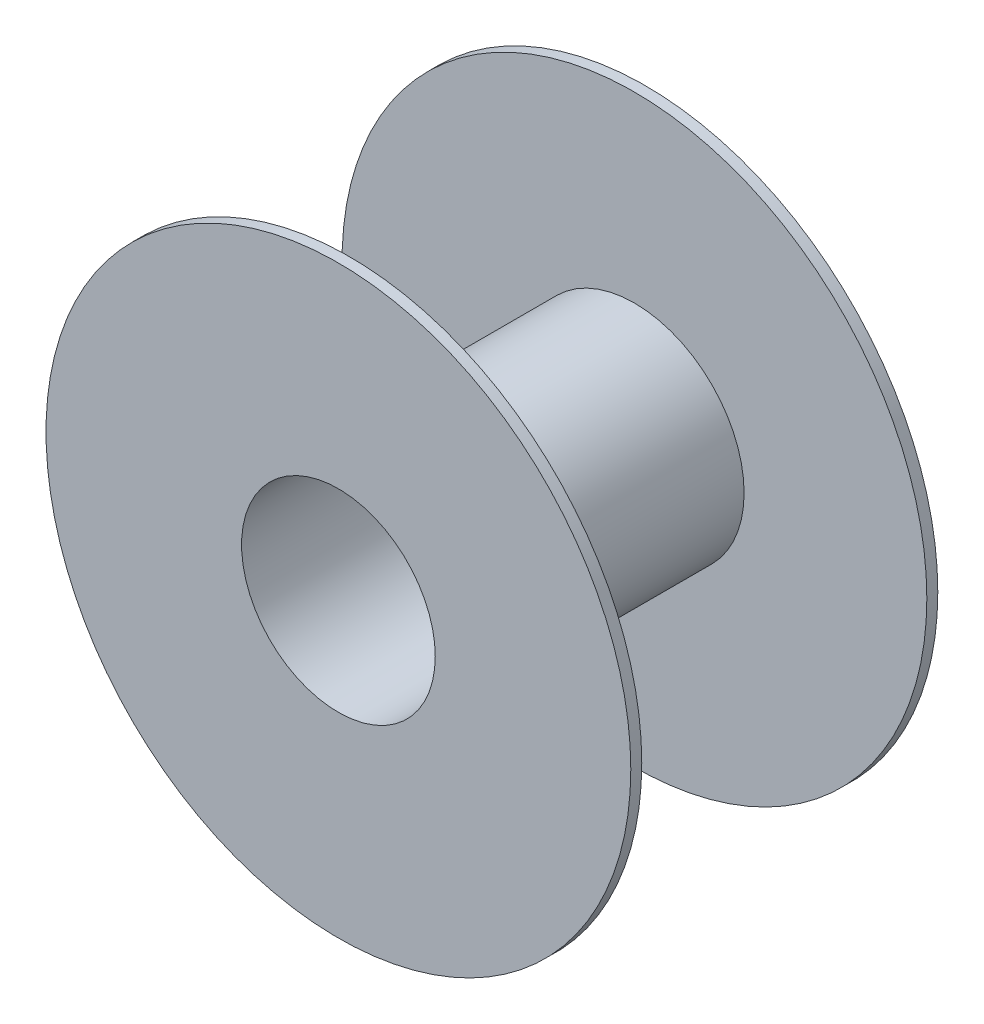
ISO-10303-21;
HEADER;
FILE_DESCRIPTION(('STEP AP214'),'2;1');
FILE_NAME('part.step','',(''),(''),'','','');
FILE_SCHEMA(('AUTOMOTIVE_DESIGN { 1 0 10303 214 1 1 1 1 }'));
ENDSEC;
DATA;
#1=APPLICATION_CONTEXT('core data for automotive mechanical design processes');
#2=APPLICATION_PROTOCOL_DEFINITION('international standard','automotive_design',2000,#1);
#3=PRODUCT_CONTEXT('',#1,'mechanical');
#4=PRODUCT('Part','Part','',(#3));
#5=PRODUCT_RELATED_PRODUCT_CATEGORY('part','',(#4));
#6=PRODUCT_DEFINITION_FORMATION('','',#4);
#7=PRODUCT_DEFINITION_CONTEXT('part definition',#1,'design');
#8=PRODUCT_DEFINITION('design','',#6,#7);
#9=PRODUCT_DEFINITION_SHAPE('','',#8);
#10=(LENGTH_UNIT() NAMED_UNIT(*) SI_UNIT(.MILLI.,.METRE.));
#11=(NAMED_UNIT(*) PLANE_ANGLE_UNIT() SI_UNIT($,.RADIAN.));
#12=(NAMED_UNIT(*) SI_UNIT($,.STERADIAN.) SOLID_ANGLE_UNIT());
#13=UNCERTAINTY_MEASURE_WITH_UNIT(LENGTH_MEASURE(1.E-05),#10,'distance_accuracy_value','');
#14=(GEOMETRIC_REPRESENTATION_CONTEXT(3) GLOBAL_UNCERTAINTY_ASSIGNED_CONTEXT((#13)) GLOBAL_UNIT_ASSIGNED_CONTEXT((#10,
#11,#12)) REPRESENTATION_CONTEXT('',''));
#15=CARTESIAN_POINT('',(0.,0.,0.));
#16=DIRECTION('',(0.,0.,1.));
#17=DIRECTION('',(1.,0.,0.));
#18=AXIS2_PLACEMENT_3D('',#15,#16,#17);
#19=CARTESIAN_POINT('',(80.,0.,0.));
#20=DIRECTION('',(0.,0.,1.));
#21=DIRECTION('',(1.,0.,0.));
#22=AXIS2_PLACEMENT_3D('',#19,#20,#21);
#23=PLANE('',#22);
#24=CARTESIAN_POINT('',(0.,0.,0.));
#25=DIRECTION('',(0.,0.,1.));
#26=DIRECTION('',(1.,0.,0.));
#27=AXIS2_PLACEMENT_3D('',#24,#25,#26);
#28=CIRCLE('',#27,80.);
#29=CARTESIAN_POINT('',(80.,0.,0.));
#30=VERTEX_POINT('',#29);
#31=EDGE_CURVE('E58',#30,#30,#28,.T.);
#32=ORIENTED_EDGE('',*,*,#31,.T.);
#33=EDGE_LOOP('',(#32));
#34=FACE_BOUND('',#33,.T.);
#35=CARTESIAN_POINT('',(0.,0.,0.));
#36=DIRECTION('',(0.,0.,1.));
#37=DIRECTION('',(1.,0.,0.));
#38=AXIS2_PLACEMENT_3D('',#35,#36,#37);
#39=CIRCLE('',#38,26.5);
#40=CARTESIAN_POINT('',(26.5,0.,0.));
#41=VERTEX_POINT('',#40);
#42=EDGE_CURVE('E10',#41,#41,#39,.T.);
#43=ORIENTED_EDGE('',*,*,#42,.F.);
#44=EDGE_LOOP('',(#43));
#45=FACE_BOUND('',#44,.T.);
#46=ADVANCED_FACE('F30',(#34,#45),#23,.T.);
#47=CARTESIAN_POINT('',(0.,0.,0.));
#48=DIRECTION('',(0.,0.,1.));
#49=DIRECTION('',(1.,0.,0.));
#50=AXIS2_PLACEMENT_3D('',#47,#48,#49);
#51=CYLINDRICAL_SURFACE('',#50,26.5);
#52=ORIENTED_EDGE('',*,*,#42,.T.);
#53=EDGE_LOOP('',(#52));
#54=FACE_BOUND('',#53,.T.);
#55=CARTESIAN_POINT('',(0.,0.,-84.));
#56=DIRECTION('',(0.,0.,1.));
#57=DIRECTION('',(1.,0.,0.));
#58=AXIS2_PLACEMENT_3D('',#55,#56,#57);
#59=CIRCLE('',#58,26.5);
#60=CARTESIAN_POINT('',(26.5,0.,-84.));
#61=VERTEX_POINT('',#60);
#62=EDGE_CURVE('E36',#61,#61,#59,.T.);
#63=ORIENTED_EDGE('',*,*,#62,.F.);
#64=EDGE_LOOP('',(#63));
#65=FACE_BOUND('',#64,.T.);
#66=ADVANCED_FACE('F76',(#54,#65),#51,.F.);
#67=CARTESIAN_POINT('',(26.5,0.,-84.));
#68=DIRECTION('',(0.,0.,-1.));
#69=DIRECTION('',(-1.,0.,0.));
#70=AXIS2_PLACEMENT_3D('',#67,#68,#69);
#71=PLANE('',#70);
#72=ORIENTED_EDGE('',*,*,#62,.T.);
#73=EDGE_LOOP('',(#72));
#74=FACE_BOUND('',#73,.T.);
#75=CARTESIAN_POINT('',(0.,0.,-84.));
#76=DIRECTION('',(0.,0.,1.));
#77=DIRECTION('',(1.,0.,0.));
#78=AXIS2_PLACEMENT_3D('',#75,#76,#77);
#79=CIRCLE('',#78,80.);
#80=CARTESIAN_POINT('',(80.,0.,-84.));
#81=VERTEX_POINT('',#80);
#82=EDGE_CURVE('E40',#81,#81,#79,.T.);
#83=ORIENTED_EDGE('',*,*,#82,.F.);
#84=EDGE_LOOP('',(#83));
#85=FACE_BOUND('',#84,.T.);
#86=ADVANCED_FACE('F80',(#74,#85),#71,.T.);
#87=CARTESIAN_POINT('',(0.,0.,0.));
#88=DIRECTION('',(0.,0.,1.));
#89=DIRECTION('',(1.,0.,0.));
#90=AXIS2_PLACEMENT_3D('',#87,#88,#89);
#91=CYLINDRICAL_SURFACE('',#90,80.);
#92=ORIENTED_EDGE('',*,*,#82,.T.);
#93=EDGE_LOOP('',(#92));
#94=FACE_BOUND('',#93,.T.);
#95=CARTESIAN_POINT('',(0.,0.,-81.));
#96=DIRECTION('',(0.,0.,1.));
#97=DIRECTION('',(1.,0.,0.));
#98=AXIS2_PLACEMENT_3D('',#95,#96,#97);
#99=CIRCLE('',#98,80.);
#100=CARTESIAN_POINT('',(80.,0.,-81.));
#101=VERTEX_POINT('',#100);
#102=EDGE_CURVE('E44',#101,#101,#99,.T.);
#103=ORIENTED_EDGE('',*,*,#102,.F.);
#104=EDGE_LOOP('',(#103));
#105=FACE_BOUND('',#104,.T.);
#106=ADVANCED_FACE('F84',(#94,#105),#91,.T.);
#107=CARTESIAN_POINT('',(80.,0.,-81.));
#108=DIRECTION('',(0.,0.,1.));
#109=DIRECTION('',(1.,0.,0.));
#110=AXIS2_PLACEMENT_3D('',#107,#108,#109);
#111=PLANE('',#110);
#112=ORIENTED_EDGE('',*,*,#102,.T.);
#113=EDGE_LOOP('',(#112));
#114=FACE_BOUND('',#113,.T.);
#115=CARTESIAN_POINT('',(0.,0.,-81.));
#116=DIRECTION('',(0.,0.,1.));
#117=DIRECTION('',(1.,0.,0.));
#118=AXIS2_PLACEMENT_3D('',#115,#116,#117);
#119=CIRCLE('',#118,30.);
#120=CARTESIAN_POINT('',(30.,0.,-81.));
#121=VERTEX_POINT('',#120);
#122=EDGE_CURVE('E49',#121,#121,#119,.T.);
#123=ORIENTED_EDGE('',*,*,#122,.F.);
#124=EDGE_LOOP('',(#123));
#125=FACE_BOUND('',#124,.T.);
#126=ADVANCED_FACE('F90',(#114,#125),#111,.T.);
#127=CARTESIAN_POINT('',(0.,0.,0.));
#128=DIRECTION('',(0.,0.,1.));
#129=DIRECTION('',(1.,0.,0.));
#130=AXIS2_PLACEMENT_3D('',#127,#128,#129);
#131=CYLINDRICAL_SURFACE('',#130,30.);
#132=ORIENTED_EDGE('',*,*,#122,.T.);
#133=EDGE_LOOP('',(#132));
#134=FACE_BOUND('',#133,.T.);
#135=CARTESIAN_POINT('',(0.,0.,-3.));
#136=DIRECTION('',(0.,0.,1.));
#137=DIRECTION('',(1.,0.,0.));
#138=AXIS2_PLACEMENT_3D('',#135,#136,#137);
#139=CIRCLE('',#138,30.);
#140=CARTESIAN_POINT('',(30.,0.,-3.));
#141=VERTEX_POINT('',#140);
#142=EDGE_CURVE('E52',#141,#141,#139,.T.);
#143=ORIENTED_EDGE('',*,*,#142,.F.);
#144=EDGE_LOOP('',(#143));
#145=FACE_BOUND('',#144,.T.);
#146=ADVANCED_FACE('F72',(#134,#145),#131,.T.);
#147=CARTESIAN_POINT('',(30.,0.,-3.));
#148=DIRECTION('',(0.,0.,-1.));
#149=DIRECTION('',(-1.,0.,0.));
#150=AXIS2_PLACEMENT_3D('',#147,#148,#149);
#151=PLANE('',#150);
#152=ORIENTED_EDGE('',*,*,#142,.T.);
#153=EDGE_LOOP('',(#152));
#154=FACE_BOUND('',#153,.T.);
#155=CARTESIAN_POINT('',(0.,0.,-3.));
#156=DIRECTION('',(0.,0.,1.));
#157=DIRECTION('',(1.,0.,0.));
#158=AXIS2_PLACEMENT_3D('',#155,#156,#157);
#159=CIRCLE('',#158,80.);
#160=CARTESIAN_POINT('',(80.,0.,-3.));
#161=VERTEX_POINT('',#160);
#162=EDGE_CURVE('E55',#161,#161,#159,.T.);
#163=ORIENTED_EDGE('',*,*,#162,.F.);
#164=EDGE_LOOP('',(#163));
#165=FACE_BOUND('',#164,.T.);
#166=ADVANCED_FACE('F66',(#154,#165),#151,.T.);
#167=CARTESIAN_POINT('',(0.,0.,0.));
#168=DIRECTION('',(0.,0.,1.));
#169=DIRECTION('',(1.,0.,0.));
#170=AXIS2_PLACEMENT_3D('',#167,#168,#169);
#171=CYLINDRICAL_SURFACE('',#170,80.);
#172=ORIENTED_EDGE('',*,*,#162,.T.);
#173=EDGE_LOOP('',(#172));
#174=FACE_BOUND('',#173,.T.);
#175=ORIENTED_EDGE('',*,*,#31,.F.);
#176=EDGE_LOOP('',(#175));
#177=FACE_BOUND('',#176,.T.);
#178=ADVANCED_FACE('F64',(#174,#177),#171,.T.);
#179=CLOSED_SHELL('',(#46,#66,#86,#106,#126,#146,#166,#178));
#180=MANIFOLD_SOLID_BREP('B2',#179);
#181=ADVANCED_BREP_SHAPE_REPRESENTATION('',(#18,#180),#14);
#182=SHAPE_DEFINITION_REPRESENTATION(#9,#181);
ENDSEC;
END-ISO-10303-21;
